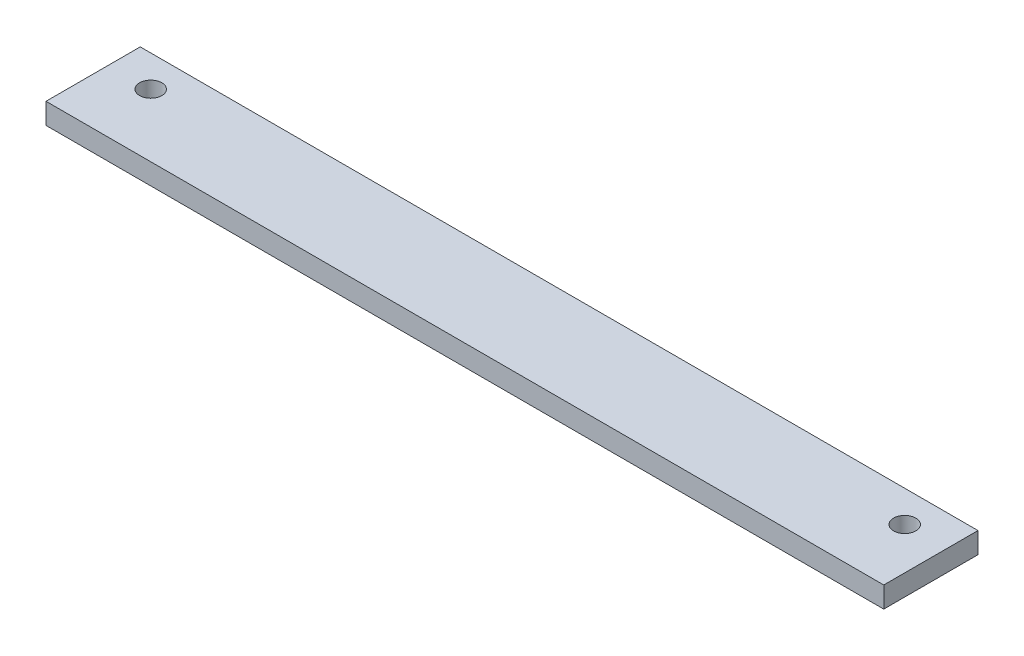
ISO-10303-21;
HEADER;
FILE_DESCRIPTION(('STEP AP214'),'2;1');
FILE_NAME('part.step','',(''),(''),'','','');
FILE_SCHEMA(('AUTOMOTIVE_DESIGN { 1 0 10303 214 1 1 1 1 }'));
ENDSEC;
DATA;
#1=APPLICATION_CONTEXT('core data for automotive mechanical design processes');
#2=APPLICATION_PROTOCOL_DEFINITION('international standard','automotive_design',2000,#1);
#3=PRODUCT_CONTEXT('',#1,'mechanical');
#4=PRODUCT('Part','Part','',(#3));
#5=PRODUCT_RELATED_PRODUCT_CATEGORY('part','',(#4));
#6=PRODUCT_DEFINITION_FORMATION('','',#4);
#7=PRODUCT_DEFINITION_CONTEXT('part definition',#1,'design');
#8=PRODUCT_DEFINITION('design','',#6,#7);
#9=PRODUCT_DEFINITION_SHAPE('','',#8);
#10=(LENGTH_UNIT() NAMED_UNIT(*) SI_UNIT(.MILLI.,.METRE.));
#11=(NAMED_UNIT(*) PLANE_ANGLE_UNIT() SI_UNIT($,.RADIAN.));
#12=(NAMED_UNIT(*) SI_UNIT($,.STERADIAN.) SOLID_ANGLE_UNIT());
#13=UNCERTAINTY_MEASURE_WITH_UNIT(LENGTH_MEASURE(1.E-05),#10,'distance_accuracy_value','');
#14=(GEOMETRIC_REPRESENTATION_CONTEXT(3) GLOBAL_UNCERTAINTY_ASSIGNED_CONTEXT((#13)) GLOBAL_UNIT_ASSIGNED_CONTEXT((#10,
#11,#12)) REPRESENTATION_CONTEXT('',''));
#15=CARTESIAN_POINT('',(0.,0.,0.));
#16=DIRECTION('',(0.,0.,1.));
#17=DIRECTION('',(1.,0.,0.));
#18=AXIS2_PLACEMENT_3D('',#15,#16,#17);
#19=CARTESIAN_POINT('',(0.,6.35,0.));
#20=DIRECTION('',(1.,0.,0.));
#21=DIRECTION('',(0.,0.,-1.));
#22=AXIS2_PLACEMENT_3D('',#19,#20,#21);
#23=PLANE('',#22);
#24=DIRECTION('',(0.,0.,1.));
#25=VECTOR('',#24,1.);
#26=CARTESIAN_POINT('',(0.,0.,0.));
#27=LINE('',#26,#25);
#28=CARTESIAN_POINT('',(0.,0.,-28.575));
#29=VERTEX_POINT('',#28);
#30=CARTESIAN_POINT('',(0.,0.,0.));
#31=VERTEX_POINT('',#30);
#32=EDGE_CURVE('E96',#29,#31,#27,.T.);
#33=ORIENTED_EDGE('',*,*,#32,.T.);
#34=DIRECTION('',(0.,-1.,0.));
#35=VECTOR('',#34,1.);
#36=CARTESIAN_POINT('',(0.,6.35,0.));
#37=LINE('',#36,#35);
#38=CARTESIAN_POINT('',(0.,6.35,0.));
#39=VERTEX_POINT('',#38);
#40=EDGE_CURVE('E11',#39,#31,#37,.T.);
#41=ORIENTED_EDGE('',*,*,#40,.F.);
#42=DIRECTION('',(0.,0.,1.));
#43=VECTOR('',#42,1.);
#44=CARTESIAN_POINT('',(0.,6.35,0.));
#45=LINE('',#44,#43);
#46=CARTESIAN_POINT('',(0.,6.35,-28.575));
#47=VERTEX_POINT('',#46);
#48=EDGE_CURVE('E84',#47,#39,#45,.T.);
#49=ORIENTED_EDGE('',*,*,#48,.F.);
#50=DIRECTION('',(0.,-1.,0.));
#51=VECTOR('',#50,1.);
#52=CARTESIAN_POINT('',(0.,6.35,-28.575));
#53=LINE('',#52,#51);
#54=EDGE_CURVE('E92',#47,#29,#53,.T.);
#55=ORIENTED_EDGE('',*,*,#54,.T.);
#56=EDGE_LOOP('',(#33,#41,#49,#55));
#57=FACE_BOUND('',#56,.T.);
#58=ADVANCED_FACE('F33',(#57),#23,.F.);
#59=CARTESIAN_POINT('',(0.,6.35,0.));
#60=DIRECTION('',(0.,0.,-1.));
#61=DIRECTION('',(-1.,0.,0.));
#62=AXIS2_PLACEMENT_3D('',#59,#60,#61);
#63=PLANE('',#62);
#64=DIRECTION('',(1.,0.,0.));
#65=VECTOR('',#64,1.);
#66=CARTESIAN_POINT('',(0.,0.,0.));
#67=LINE('',#66,#65);
#68=CARTESIAN_POINT('',(254.,0.,0.));
#69=VERTEX_POINT('',#68);
#70=EDGE_CURVE('E88',#31,#69,#67,.T.);
#71=ORIENTED_EDGE('',*,*,#70,.T.);
#72=DIRECTION('',(0.,-1.,0.));
#73=VECTOR('',#72,1.);
#74=CARTESIAN_POINT('',(254.,6.35,0.));
#75=LINE('',#74,#73);
#76=CARTESIAN_POINT('',(254.,6.35,0.));
#77=VERTEX_POINT('',#76);
#78=EDGE_CURVE('E41',#77,#69,#75,.T.);
#79=ORIENTED_EDGE('',*,*,#78,.F.);
#80=DIRECTION('',(1.,0.,0.));
#81=VECTOR('',#80,1.);
#82=CARTESIAN_POINT('',(0.,6.35,0.));
#83=LINE('',#82,#81);
#84=EDGE_CURVE('E79',#39,#77,#83,.T.);
#85=ORIENTED_EDGE('',*,*,#84,.F.);
#86=ORIENTED_EDGE('',*,*,#40,.T.);
#87=EDGE_LOOP('',(#71,#79,#85,#86));
#88=FACE_BOUND('',#87,.T.);
#89=ADVANCED_FACE('F87',(#88),#63,.F.);
#90=CARTESIAN_POINT('',(254.,6.35,0.));
#91=DIRECTION('',(-1.,0.,0.));
#92=DIRECTION('',(0.,0.,1.));
#93=AXIS2_PLACEMENT_3D('',#90,#91,#92);
#94=PLANE('',#93);
#95=DIRECTION('',(0.,0.,-1.));
#96=VECTOR('',#95,1.);
#97=CARTESIAN_POINT('',(254.,0.,0.));
#98=LINE('',#97,#96);
#99=CARTESIAN_POINT('',(254.,0.,-28.575));
#100=VERTEX_POINT('',#99);
#101=EDGE_CURVE('E66',#69,#100,#98,.T.);
#102=ORIENTED_EDGE('',*,*,#101,.T.);
#103=DIRECTION('',(0.,-1.,0.));
#104=VECTOR('',#103,1.);
#105=CARTESIAN_POINT('',(254.,6.35,-28.575));
#106=LINE('',#105,#104);
#107=CARTESIAN_POINT('',(254.,6.35,-28.575));
#108=VERTEX_POINT('',#107);
#109=EDGE_CURVE('E89',#108,#100,#106,.T.);
#110=ORIENTED_EDGE('',*,*,#109,.F.);
#111=DIRECTION('',(0.,0.,-1.));
#112=VECTOR('',#111,1.);
#113=CARTESIAN_POINT('',(254.,6.35,0.));
#114=LINE('',#113,#112);
#115=EDGE_CURVE('E82',#77,#108,#114,.T.);
#116=ORIENTED_EDGE('',*,*,#115,.F.);
#117=ORIENTED_EDGE('',*,*,#78,.T.);
#118=EDGE_LOOP('',(#102,#110,#116,#117));
#119=FACE_BOUND('',#118,.T.);
#120=ADVANCED_FACE('F90',(#119),#94,.F.);
#121=CARTESIAN_POINT('',(0.,6.35,-28.575));
#122=DIRECTION('',(0.,0.,1.));
#123=DIRECTION('',(1.,0.,0.));
#124=AXIS2_PLACEMENT_3D('',#121,#122,#123);
#125=PLANE('',#124);
#126=DIRECTION('',(-1.,0.,0.));
#127=VECTOR('',#126,1.);
#128=CARTESIAN_POINT('',(0.,0.,-28.575));
#129=LINE('',#128,#127);
#130=EDGE_CURVE('E72',#100,#29,#129,.T.);
#131=ORIENTED_EDGE('',*,*,#130,.T.);
#132=ORIENTED_EDGE('',*,*,#54,.F.);
#133=DIRECTION('',(-1.,0.,0.));
#134=VECTOR('',#133,1.);
#135=CARTESIAN_POINT('',(0.,6.35,-28.575));
#136=LINE('',#135,#134);
#137=EDGE_CURVE('E49',#108,#47,#136,.T.);
#138=ORIENTED_EDGE('',*,*,#137,.F.);
#139=ORIENTED_EDGE('',*,*,#109,.T.);
#140=EDGE_LOOP('',(#131,#132,#138,#139));
#141=FACE_BOUND('',#140,.T.);
#142=ADVANCED_FACE('F104',(#141),#125,.F.);
#143=CARTESIAN_POINT('',(0.,6.35,0.));
#144=DIRECTION('',(0.,-1.,0.));
#145=DIRECTION('',(0.,0.,-1.));
#146=AXIS2_PLACEMENT_3D('',#143,#144,#145);
#147=PLANE('',#146);
#148=CARTESIAN_POINT('',(12.7,6.35,-19.05));
#149=DIRECTION('',(0.,1.,0.));
#150=DIRECTION('',(0.,0.,1.));
#151=AXIS2_PLACEMENT_3D('',#148,#149,#150);
#152=CIRCLE('',#151,3.37350099999999);
#153=CARTESIAN_POINT('',(12.7,6.35,-15.676499));
#154=VERTEX_POINT('',#153);
#155=EDGE_CURVE('E118',#154,#154,#152,.T.);
#156=ORIENTED_EDGE('',*,*,#155,.F.);
#157=EDGE_LOOP('',(#156));
#158=FACE_BOUND('',#157,.T.);
#159=CARTESIAN_POINT('',(241.3,6.35,-19.05));
#160=DIRECTION('',(0.,1.,0.));
#161=DIRECTION('',(0.,0.,1.));
#162=AXIS2_PLACEMENT_3D('',#159,#160,#161);
#163=CIRCLE('',#162,3.373501);
#164=CARTESIAN_POINT('',(241.3,6.35,-15.676499));
#165=VERTEX_POINT('',#164);
#166=EDGE_CURVE('E112',#165,#165,#163,.T.);
#167=ORIENTED_EDGE('',*,*,#166,.F.);
#168=EDGE_LOOP('',(#167));
#169=FACE_BOUND('',#168,.T.);
#170=ORIENTED_EDGE('',*,*,#48,.T.);
#171=ORIENTED_EDGE('',*,*,#84,.T.);
#172=ORIENTED_EDGE('',*,*,#115,.T.);
#173=ORIENTED_EDGE('',*,*,#137,.T.);
#174=EDGE_LOOP('',(#170,#171,#172,#173));
#175=FACE_BOUND('',#174,.T.);
#176=ADVANCED_FACE('F80',(#158,#169,#175),#147,.F.);
#177=CARTESIAN_POINT('',(0.,0.,0.));
#178=DIRECTION('',(0.,-1.,0.));
#179=DIRECTION('',(0.,0.,-1.));
#180=AXIS2_PLACEMENT_3D('',#177,#178,#179);
#181=PLANE('',#180);
#182=CARTESIAN_POINT('',(12.7,0.,-19.05));
#183=DIRECTION('',(0.,1.,0.));
#184=DIRECTION('',(0.,0.,1.));
#185=AXIS2_PLACEMENT_3D('',#182,#183,#184);
#186=CIRCLE('',#185,3.37350099999999);
#187=CARTESIAN_POINT('',(12.7,0.,-15.676499));
#188=VERTEX_POINT('',#187);
#189=EDGE_CURVE('E115',#188,#188,#186,.T.);
#190=ORIENTED_EDGE('',*,*,#189,.T.);
#191=EDGE_LOOP('',(#190));
#192=FACE_BOUND('',#191,.T.);
#193=CARTESIAN_POINT('',(241.3,0.,-19.05));
#194=DIRECTION('',(0.,1.,0.));
#195=DIRECTION('',(0.,0.,1.));
#196=AXIS2_PLACEMENT_3D('',#193,#194,#195);
#197=CIRCLE('',#196,3.373501);
#198=CARTESIAN_POINT('',(241.3,0.,-15.676499));
#199=VERTEX_POINT('',#198);
#200=EDGE_CURVE('E99',#199,#199,#197,.T.);
#201=ORIENTED_EDGE('',*,*,#200,.T.);
#202=EDGE_LOOP('',(#201));
#203=FACE_BOUND('',#202,.T.);
#204=ORIENTED_EDGE('',*,*,#32,.F.);
#205=ORIENTED_EDGE('',*,*,#130,.F.);
#206=ORIENTED_EDGE('',*,*,#101,.F.);
#207=ORIENTED_EDGE('',*,*,#70,.F.);
#208=EDGE_LOOP('',(#204,#205,#206,#207));
#209=FACE_BOUND('',#208,.T.);
#210=ADVANCED_FACE('F107',(#192,#203,#209),#181,.T.);
#211=CARTESIAN_POINT('',(241.3,6.35,-19.05));
#212=DIRECTION('',(0.,1.,0.));
#213=DIRECTION('',(0.,0.,1.));
#214=AXIS2_PLACEMENT_3D('',#211,#212,#213);
#215=CYLINDRICAL_SURFACE('',#214,3.373501);
#216=ORIENTED_EDGE('',*,*,#200,.F.);
#217=EDGE_LOOP('',(#216));
#218=FACE_BOUND('',#217,.T.);
#219=ORIENTED_EDGE('',*,*,#166,.T.);
#220=EDGE_LOOP('',(#219));
#221=FACE_BOUND('',#220,.T.);
#222=ADVANCED_FACE('F129',(#218,#221),#215,.F.);
#223=CARTESIAN_POINT('',(12.7,6.35,-19.05));
#224=DIRECTION('',(0.,1.,0.));
#225=DIRECTION('',(0.,0.,1.));
#226=AXIS2_PLACEMENT_3D('',#223,#224,#225);
#227=CYLINDRICAL_SURFACE('',#226,3.37350099999999);
#228=ORIENTED_EDGE('',*,*,#189,.F.);
#229=EDGE_LOOP('',(#228));
#230=FACE_BOUND('',#229,.T.);
#231=ORIENTED_EDGE('',*,*,#155,.T.);
#232=EDGE_LOOP('',(#231));
#233=FACE_BOUND('',#232,.T.);
#234=ADVANCED_FACE('F122',(#230,#233),#227,.F.);
#235=CLOSED_SHELL('',(#58,#89,#120,#142,#176,#210,#222,#234));
#236=MANIFOLD_SOLID_BREP('B2',#235);
#237=ADVANCED_BREP_SHAPE_REPRESENTATION('',(#18,#236),#14);
#238=SHAPE_DEFINITION_REPRESENTATION(#9,#237);
ENDSEC;
END-ISO-10303-21;
